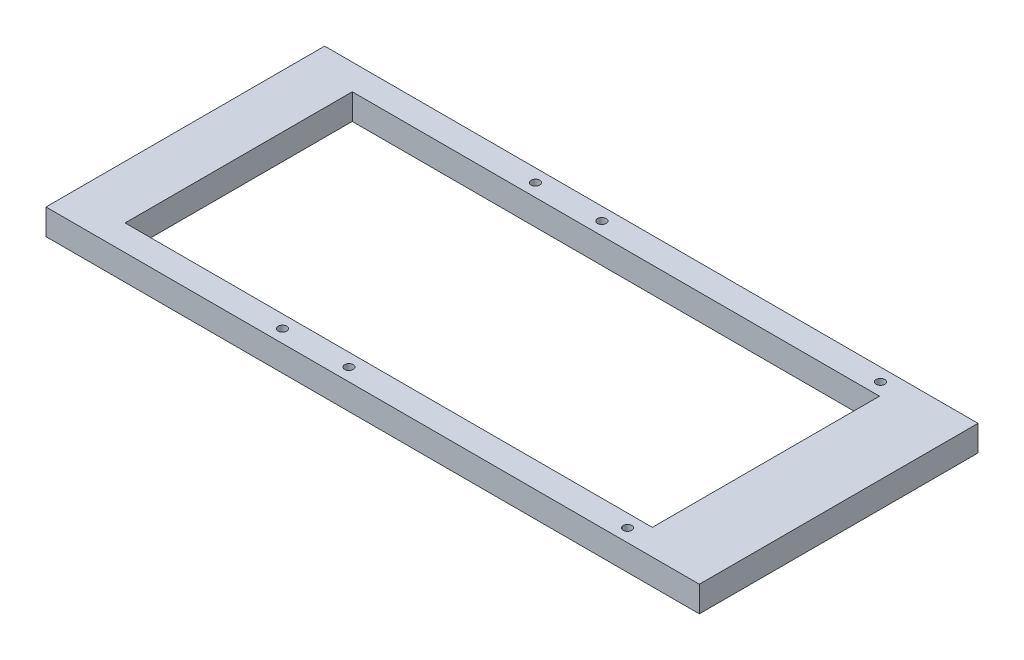
ISO-10303-21;
HEADER;
FILE_DESCRIPTION(('STEP AP214'),'2;1');
FILE_NAME('part.step','',(''),(''),'','','');
FILE_SCHEMA(('AUTOMOTIVE_DESIGN { 1 0 10303 214 1 1 1 1 }'));
ENDSEC;
DATA;
#1=APPLICATION_CONTEXT('core data for automotive mechanical design processes');
#2=APPLICATION_PROTOCOL_DEFINITION('international standard','automotive_design',2000,#1);
#3=PRODUCT_CONTEXT('',#1,'mechanical');
#4=PRODUCT('Part','Part','',(#3));
#5=PRODUCT_RELATED_PRODUCT_CATEGORY('part','',(#4));
#6=PRODUCT_DEFINITION_FORMATION('','',#4);
#7=PRODUCT_DEFINITION_CONTEXT('part definition',#1,'design');
#8=PRODUCT_DEFINITION('design','',#6,#7);
#9=PRODUCT_DEFINITION_SHAPE('','',#8);
#10=(LENGTH_UNIT() NAMED_UNIT(*) SI_UNIT(.MILLI.,.METRE.));
#11=(NAMED_UNIT(*) PLANE_ANGLE_UNIT() SI_UNIT($,.RADIAN.));
#12=(NAMED_UNIT(*) SI_UNIT($,.STERADIAN.) SOLID_ANGLE_UNIT());
#13=UNCERTAINTY_MEASURE_WITH_UNIT(LENGTH_MEASURE(1.E-05),#10,'distance_accuracy_value','');
#14=(GEOMETRIC_REPRESENTATION_CONTEXT(3) GLOBAL_UNCERTAINTY_ASSIGNED_CONTEXT((#13)) GLOBAL_UNIT_ASSIGNED_CONTEXT((#10,
#11,#12)) REPRESENTATION_CONTEXT('',''));
#15=CARTESIAN_POINT('',(0.,0.,0.));
#16=DIRECTION('',(0.,0.,1.));
#17=DIRECTION('',(1.,0.,0.));
#18=AXIS2_PLACEMENT_3D('',#15,#16,#17);
#19=CARTESIAN_POINT('',(0.,12.,0.));
#20=DIRECTION('',(0.,1.,0.));
#21=DIRECTION('',(0.,0.,1.));
#22=AXIS2_PLACEMENT_3D('',#19,#20,#21);
#23=PLANE('',#22);
#24=CARTESIAN_POINT('',(95.4999999999999,12.,-59.));
#25=DIRECTION('',(0.,-1.,0.));
#26=DIRECTION('',(0.,0.,-1.));
#27=AXIS2_PLACEMENT_3D('',#24,#25,#26);
#28=CIRCLE('',#27,2.);
#29=CARTESIAN_POINT('',(95.4999999999999,12.,-61.));
#30=VERTEX_POINT('',#29);
#31=EDGE_CURVE('E196',#30,#30,#28,.T.);
#32=ORIENTED_EDGE('',*,*,#31,.T.);
#33=EDGE_LOOP('',(#32));
#34=FACE_BOUND('',#33,.T.);
#35=CARTESIAN_POINT('',(95.4999999999999,12.,59.));
#36=DIRECTION('',(0.,1.,0.));
#37=DIRECTION('',(0.,0.,1.));
#38=AXIS2_PLACEMENT_3D('',#35,#36,#37);
#39=CIRCLE('',#38,2.);
#40=CARTESIAN_POINT('',(95.4999999999999,12.,61.));
#41=VERTEX_POINT('',#40);
#42=EDGE_CURVE('E186',#41,#41,#39,.T.);
#43=ORIENTED_EDGE('',*,*,#42,.F.);
#44=EDGE_LOOP('',(#43));
#45=FACE_BOUND('',#44,.T.);
#46=CARTESIAN_POINT('',(-34.5000000000001,12.,59.));
#47=DIRECTION('',(0.,1.,0.));
#48=DIRECTION('',(0.,0.,1.));
#49=AXIS2_PLACEMENT_3D('',#46,#47,#48);
#50=CIRCLE('',#49,2.);
#51=CARTESIAN_POINT('',(-34.5000000000001,12.,61.));
#52=VERTEX_POINT('',#51);
#53=EDGE_CURVE('E183',#52,#52,#50,.T.);
#54=ORIENTED_EDGE('',*,*,#53,.F.);
#55=EDGE_LOOP('',(#54));
#56=FACE_BOUND('',#55,.T.);
#57=CARTESIAN_POINT('',(-34.5000000000001,12.,-59.));
#58=DIRECTION('',(0.,-1.,0.));
#59=DIRECTION('',(0.,0.,-1.));
#60=AXIS2_PLACEMENT_3D('',#57,#58,#59);
#61=CIRCLE('',#60,2.);
#62=CARTESIAN_POINT('',(-34.5000000000001,12.,-61.));
#63=VERTEX_POINT('',#62);
#64=EDGE_CURVE('E180',#63,#63,#61,.T.);
#65=ORIENTED_EDGE('',*,*,#64,.T.);
#66=EDGE_LOOP('',(#65));
#67=FACE_BOUND('',#66,.T.);
#68=CARTESIAN_POINT('',(-65.5000000000001,12.,-59.));
#69=DIRECTION('',(0.,-1.,0.));
#70=DIRECTION('',(0.,0.,-1.));
#71=AXIS2_PLACEMENT_3D('',#68,#69,#70);
#72=CIRCLE('',#71,2.);
#73=CARTESIAN_POINT('',(-65.5000000000001,12.,-61.));
#74=VERTEX_POINT('',#73);
#75=EDGE_CURVE('E176',#74,#74,#72,.T.);
#76=ORIENTED_EDGE('',*,*,#75,.T.);
#77=EDGE_LOOP('',(#76));
#78=FACE_BOUND('',#77,.T.);
#79=CARTESIAN_POINT('',(-65.5000000000001,12.,59.));
#80=DIRECTION('',(0.,1.,0.));
#81=DIRECTION('',(0.,0.,1.));
#82=AXIS2_PLACEMENT_3D('',#79,#80,#81);
#83=CIRCLE('',#82,2.);
#84=CARTESIAN_POINT('',(-65.5000000000001,12.,61.));
#85=VERTEX_POINT('',#84);
#86=EDGE_CURVE('E172',#85,#85,#83,.T.);
#87=ORIENTED_EDGE('',*,*,#86,.F.);
#88=EDGE_LOOP('',(#87));
#89=FACE_BOUND('',#88,.T.);
#90=DIRECTION('',(0.,0.,-1.));
#91=VECTOR('',#90,1.);
#92=CARTESIAN_POINT('',(135.,12.,-65.));
#93=LINE('',#92,#91);
#94=CARTESIAN_POINT('',(135.,12.,65.));
#95=VERTEX_POINT('',#94);
#96=CARTESIAN_POINT('',(135.,12.,-65.));
#97=VERTEX_POINT('',#96);
#98=EDGE_CURVE('E144',#95,#97,#93,.T.);
#99=ORIENTED_EDGE('',*,*,#98,.T.);
#100=DIRECTION('',(-1.,0.,0.));
#101=VECTOR('',#100,1.);
#102=CARTESIAN_POINT('',(-135.,12.,-65.));
#103=LINE('',#102,#101);
#104=CARTESIAN_POINT('',(-169.840376893696,12.,-65.));
#105=VERTEX_POINT('',#104);
#106=EDGE_CURVE('E147',#97,#105,#103,.T.);
#107=ORIENTED_EDGE('',*,*,#106,.T.);
#108=DIRECTION('',(0.,0.,1.));
#109=VECTOR('',#108,1.);
#110=CARTESIAN_POINT('',(-169.840376893696,12.,65.));
#111=LINE('',#110,#109);
#112=CARTESIAN_POINT('',(-169.840376893696,12.,65.));
#113=VERTEX_POINT('',#112);
#114=EDGE_CURVE('E150',#105,#113,#111,.T.);
#115=ORIENTED_EDGE('',*,*,#114,.T.);
#116=DIRECTION('',(1.,0.,0.));
#117=VECTOR('',#116,1.);
#118=CARTESIAN_POINT('',(-135.,12.,65.));
#119=LINE('',#118,#117);
#120=EDGE_CURVE('E152',#113,#95,#119,.T.);
#121=ORIENTED_EDGE('',*,*,#120,.T.);
#122=EDGE_LOOP('',(#99,#107,#115,#121));
#123=FACE_BOUND('',#122,.T.);
#124=DIRECTION('',(-1.,0.,0.));
#125=VECTOR('',#124,1.);
#126=CARTESIAN_POINT('',(-144.947414211765,12.,-53.));
#127=LINE('',#126,#125);
#128=CARTESIAN_POINT('',(101.052585788235,12.,-53.));
#129=VERTEX_POINT('',#128);
#130=CARTESIAN_POINT('',(-144.947414211765,12.,-53.));
#131=VERTEX_POINT('',#130);
#132=EDGE_CURVE('E114',#129,#131,#127,.T.);
#133=ORIENTED_EDGE('',*,*,#132,.F.);
#134=DIRECTION('',(0.,0.,-1.));
#135=VECTOR('',#134,1.);
#136=CARTESIAN_POINT('',(101.052585788235,12.,-53.));
#137=LINE('',#136,#135);
#138=CARTESIAN_POINT('',(101.052585788235,12.,53.));
#139=VERTEX_POINT('',#138);
#140=EDGE_CURVE('E106',#139,#129,#137,.T.);
#141=ORIENTED_EDGE('',*,*,#140,.F.);
#142=DIRECTION('',(1.,0.,0.));
#143=VECTOR('',#142,1.);
#144=CARTESIAN_POINT('',(-144.947414211765,12.,53.));
#145=LINE('',#144,#143);
#146=CARTESIAN_POINT('',(-144.947414211765,12.,53.));
#147=VERTEX_POINT('',#146);
#148=EDGE_CURVE('E128',#147,#139,#145,.T.);
#149=ORIENTED_EDGE('',*,*,#148,.F.);
#150=DIRECTION('',(0.,0.,1.));
#151=VECTOR('',#150,1.);
#152=CARTESIAN_POINT('',(-144.947414211765,12.,-53.));
#153=LINE('',#152,#151);
#154=EDGE_CURVE('E126',#131,#147,#153,.T.);
#155=ORIENTED_EDGE('',*,*,#154,.F.);
#156=EDGE_LOOP('',(#133,#141,#149,#155));
#157=FACE_BOUND('',#156,.T.);
#158=ADVANCED_FACE('F39',(#34,#45,#56,#67,#78,#89,#123,#157),#23,.T.);
#159=CARTESIAN_POINT('',(0.,0.,0.));
#160=DIRECTION('',(0.,1.,0.));
#161=DIRECTION('',(0.,0.,1.));
#162=AXIS2_PLACEMENT_3D('',#159,#160,#161);
#163=PLANE('',#162);
#164=CARTESIAN_POINT('',(95.4999999999999,0.,-59.));
#165=DIRECTION('',(0.,1.,0.));
#166=DIRECTION('',(0.,0.,1.));
#167=AXIS2_PLACEMENT_3D('',#164,#165,#166);
#168=CIRCLE('',#167,2.);
#169=CARTESIAN_POINT('',(95.4999999999999,0.,-57.));
#170=VERTEX_POINT('',#169);
#171=EDGE_CURVE('E43',#170,#170,#168,.F.);
#172=ORIENTED_EDGE('',*,*,#171,.F.);
#173=EDGE_LOOP('',(#172));
#174=FACE_BOUND('',#173,.T.);
#175=CARTESIAN_POINT('',(95.4999999999999,0.,59.));
#176=DIRECTION('',(0.,1.,0.));
#177=DIRECTION('',(0.,0.,1.));
#178=AXIS2_PLACEMENT_3D('',#175,#176,#177);
#179=CIRCLE('',#178,2.);
#180=CARTESIAN_POINT('',(95.4999999999999,0.,61.));
#181=VERTEX_POINT('',#180);
#182=EDGE_CURVE('E184',#181,#181,#179,.T.);
#183=ORIENTED_EDGE('',*,*,#182,.T.);
#184=EDGE_LOOP('',(#183));
#185=FACE_BOUND('',#184,.T.);
#186=CARTESIAN_POINT('',(-34.5000000000001,0.,59.));
#187=DIRECTION('',(0.,1.,0.));
#188=DIRECTION('',(0.,0.,1.));
#189=AXIS2_PLACEMENT_3D('',#186,#187,#188);
#190=CIRCLE('',#189,2.);
#191=CARTESIAN_POINT('',(-34.5000000000001,0.,61.));
#192=VERTEX_POINT('',#191);
#193=EDGE_CURVE('E181',#192,#192,#190,.T.);
#194=ORIENTED_EDGE('',*,*,#193,.T.);
#195=EDGE_LOOP('',(#194));
#196=FACE_BOUND('',#195,.T.);
#197=CARTESIAN_POINT('',(-34.5000000000001,0.,-59.));
#198=DIRECTION('',(0.,1.,0.));
#199=DIRECTION('',(0.,0.,1.));
#200=AXIS2_PLACEMENT_3D('',#197,#198,#199);
#201=CIRCLE('',#200,2.);
#202=CARTESIAN_POINT('',(-34.5000000000001,0.,-57.));
#203=VERTEX_POINT('',#202);
#204=EDGE_CURVE('E177',#203,#203,#201,.F.);
#205=ORIENTED_EDGE('',*,*,#204,.F.);
#206=EDGE_LOOP('',(#205));
#207=FACE_BOUND('',#206,.T.);
#208=CARTESIAN_POINT('',(-65.5000000000001,0.,-59.));
#209=DIRECTION('',(0.,1.,0.));
#210=DIRECTION('',(0.,0.,1.));
#211=AXIS2_PLACEMENT_3D('',#208,#209,#210);
#212=CIRCLE('',#211,2.);
#213=CARTESIAN_POINT('',(-65.5000000000001,0.,-57.));
#214=VERTEX_POINT('',#213);
#215=EDGE_CURVE('E173',#214,#214,#212,.F.);
#216=ORIENTED_EDGE('',*,*,#215,.F.);
#217=EDGE_LOOP('',(#216));
#218=FACE_BOUND('',#217,.T.);
#219=CARTESIAN_POINT('',(-65.5000000000001,0.,59.));
#220=DIRECTION('',(0.,1.,0.));
#221=DIRECTION('',(0.,0.,1.));
#222=AXIS2_PLACEMENT_3D('',#219,#220,#221);
#223=CIRCLE('',#222,2.);
#224=CARTESIAN_POINT('',(-65.5000000000001,0.,61.));
#225=VERTEX_POINT('',#224);
#226=EDGE_CURVE('E134',#225,#225,#223,.T.);
#227=ORIENTED_EDGE('',*,*,#226,.T.);
#228=EDGE_LOOP('',(#227));
#229=FACE_BOUND('',#228,.T.);
#230=DIRECTION('',(0.,0.,-1.));
#231=VECTOR('',#230,1.);
#232=CARTESIAN_POINT('',(135.,0.,-65.));
#233=LINE('',#232,#231);
#234=CARTESIAN_POINT('',(135.,0.,65.));
#235=VERTEX_POINT('',#234);
#236=CARTESIAN_POINT('',(135.,0.,-65.));
#237=VERTEX_POINT('',#236);
#238=EDGE_CURVE('E122',#235,#237,#233,.T.);
#239=ORIENTED_EDGE('',*,*,#238,.F.);
#240=DIRECTION('',(1.,0.,0.));
#241=VECTOR('',#240,1.);
#242=CARTESIAN_POINT('',(-135.,0.,65.));
#243=LINE('',#242,#241);
#244=CARTESIAN_POINT('',(-169.840376893696,0.,65.));
#245=VERTEX_POINT('',#244);
#246=EDGE_CURVE('E148',#245,#235,#243,.T.);
#247=ORIENTED_EDGE('',*,*,#246,.F.);
#248=DIRECTION('',(0.,0.,1.));
#249=VECTOR('',#248,1.);
#250=CARTESIAN_POINT('',(-169.840376893696,0.,65.));
#251=LINE('',#250,#249);
#252=CARTESIAN_POINT('',(-169.840376893696,0.,-65.));
#253=VERTEX_POINT('',#252);
#254=EDGE_CURVE('E159',#253,#245,#251,.T.);
#255=ORIENTED_EDGE('',*,*,#254,.F.);
#256=DIRECTION('',(-1.,0.,0.));
#257=VECTOR('',#256,1.);
#258=CARTESIAN_POINT('',(-169.840376893696,0.,-65.));
#259=LINE('',#258,#257);
#260=EDGE_CURVE('E157',#237,#253,#259,.T.);
#261=ORIENTED_EDGE('',*,*,#260,.F.);
#262=EDGE_LOOP('',(#239,#247,#255,#261));
#263=FACE_BOUND('',#262,.T.);
#264=DIRECTION('',(0.,0.,-1.));
#265=VECTOR('',#264,1.);
#266=CARTESIAN_POINT('',(101.052585788235,0.,-53.));
#267=LINE('',#266,#265);
#268=CARTESIAN_POINT('',(101.052585788235,0.,53.));
#269=VERTEX_POINT('',#268);
#270=CARTESIAN_POINT('',(101.052585788235,0.,-53.));
#271=VERTEX_POINT('',#270);
#272=EDGE_CURVE('E64',#269,#271,#267,.T.);
#273=ORIENTED_EDGE('',*,*,#272,.T.);
#274=DIRECTION('',(-1.,0.,0.));
#275=VECTOR('',#274,1.);
#276=CARTESIAN_POINT('',(-144.947414211765,0.,-53.));
#277=LINE('',#276,#275);
#278=CARTESIAN_POINT('',(-144.947414211765,0.,-53.));
#279=VERTEX_POINT('',#278);
#280=EDGE_CURVE('E121',#271,#279,#277,.T.);
#281=ORIENTED_EDGE('',*,*,#280,.T.);
#282=DIRECTION('',(0.,0.,1.));
#283=VECTOR('',#282,1.);
#284=CARTESIAN_POINT('',(-144.947414211765,0.,-53.));
#285=LINE('',#284,#283);
#286=CARTESIAN_POINT('',(-144.947414211765,0.,53.));
#287=VERTEX_POINT('',#286);
#288=EDGE_CURVE('E136',#279,#287,#285,.T.);
#289=ORIENTED_EDGE('',*,*,#288,.T.);
#290=DIRECTION('',(1.,0.,0.));
#291=VECTOR('',#290,1.);
#292=CARTESIAN_POINT('',(-144.947414211765,0.,53.));
#293=LINE('',#292,#291);
#294=EDGE_CURVE('E115',#287,#269,#293,.T.);
#295=ORIENTED_EDGE('',*,*,#294,.T.);
#296=EDGE_LOOP('',(#273,#281,#289,#295));
#297=FACE_BOUND('',#296,.T.);
#298=ADVANCED_FACE('F210',(#174,#185,#196,#207,#218,#229,#263,#297),#163,.F.);
#299=CARTESIAN_POINT('',(135.,12.,-65.));
#300=DIRECTION('',(-1.,0.,0.));
#301=DIRECTION('',(0.,0.,1.));
#302=AXIS2_PLACEMENT_3D('',#299,#300,#301);
#303=PLANE('',#302);
#304=ORIENTED_EDGE('',*,*,#238,.T.);
#305=DIRECTION('',(0.,-1.,0.));
#306=VECTOR('',#305,1.);
#307=CARTESIAN_POINT('',(135.,12.,-65.));
#308=LINE('',#307,#306);
#309=EDGE_CURVE('E11',#97,#237,#308,.T.);
#310=ORIENTED_EDGE('',*,*,#309,.F.);
#311=ORIENTED_EDGE('',*,*,#98,.F.);
#312=DIRECTION('',(0.,-1.,0.));
#313=VECTOR('',#312,1.);
#314=CARTESIAN_POINT('',(135.,12.,65.));
#315=LINE('',#314,#313);
#316=EDGE_CURVE('E154',#95,#235,#315,.T.);
#317=ORIENTED_EDGE('',*,*,#316,.T.);
#318=EDGE_LOOP('',(#304,#310,#311,#317));
#319=FACE_BOUND('',#318,.T.);
#320=ADVANCED_FACE('F41',(#319),#303,.F.);
#321=CARTESIAN_POINT('',(-169.840376893696,12.,-65.));
#322=DIRECTION('',(0.,0.,1.));
#323=DIRECTION('',(1.,0.,0.));
#324=AXIS2_PLACEMENT_3D('',#321,#322,#323);
#325=PLANE('',#324);
#326=ORIENTED_EDGE('',*,*,#260,.T.);
#327=DIRECTION('',(0.,-1.,0.));
#328=VECTOR('',#327,1.);
#329=CARTESIAN_POINT('',(-169.840376893696,12.,-65.));
#330=LINE('',#329,#328);
#331=EDGE_CURVE('E48',#105,#253,#330,.T.);
#332=ORIENTED_EDGE('',*,*,#331,.F.);
#333=ORIENTED_EDGE('',*,*,#106,.F.);
#334=ORIENTED_EDGE('',*,*,#309,.T.);
#335=EDGE_LOOP('',(#326,#332,#333,#334));
#336=FACE_BOUND('',#335,.T.);
#337=ADVANCED_FACE('F221',(#336),#325,.F.);
#338=CARTESIAN_POINT('',(-169.840376893696,12.,65.));
#339=DIRECTION('',(1.,0.,0.));
#340=DIRECTION('',(0.,0.,-1.));
#341=AXIS2_PLACEMENT_3D('',#338,#339,#340);
#342=PLANE('',#341);
#343=ORIENTED_EDGE('',*,*,#254,.T.);
#344=DIRECTION('',(0.,-1.,0.));
#345=VECTOR('',#344,1.);
#346=CARTESIAN_POINT('',(-169.840376893696,12.,65.));
#347=LINE('',#346,#345);
#348=EDGE_CURVE('E165',#113,#245,#347,.T.);
#349=ORIENTED_EDGE('',*,*,#348,.F.);
#350=ORIENTED_EDGE('',*,*,#114,.F.);
#351=ORIENTED_EDGE('',*,*,#331,.T.);
#352=EDGE_LOOP('',(#343,#349,#350,#351));
#353=FACE_BOUND('',#352,.T.);
#354=ADVANCED_FACE('F226',(#353),#342,.F.);
#355=CARTESIAN_POINT('',(-135.,12.,65.));
#356=DIRECTION('',(0.,0.,-1.));
#357=DIRECTION('',(-1.,0.,0.));
#358=AXIS2_PLACEMENT_3D('',#355,#356,#357);
#359=PLANE('',#358);
#360=ORIENTED_EDGE('',*,*,#246,.T.);
#361=ORIENTED_EDGE('',*,*,#316,.F.);
#362=ORIENTED_EDGE('',*,*,#120,.F.);
#363=ORIENTED_EDGE('',*,*,#348,.T.);
#364=EDGE_LOOP('',(#360,#361,#362,#363));
#365=FACE_BOUND('',#364,.T.);
#366=ADVANCED_FACE('F228',(#365),#359,.F.);
#367=CARTESIAN_POINT('',(101.052585788235,12.,-53.));
#368=DIRECTION('',(-1.,0.,0.));
#369=DIRECTION('',(0.,0.,1.));
#370=AXIS2_PLACEMENT_3D('',#367,#368,#369);
#371=PLANE('',#370);
#372=ORIENTED_EDGE('',*,*,#272,.F.);
#373=DIRECTION('',(0.,-1.,0.));
#374=VECTOR('',#373,1.);
#375=CARTESIAN_POINT('',(101.052585788235,12.,53.));
#376=LINE('',#375,#374);
#377=EDGE_CURVE('E110',#139,#269,#376,.T.);
#378=ORIENTED_EDGE('',*,*,#377,.F.);
#379=ORIENTED_EDGE('',*,*,#140,.T.);
#380=DIRECTION('',(0.,-1.,0.));
#381=VECTOR('',#380,1.);
#382=CARTESIAN_POINT('',(101.052585788235,12.,-53.));
#383=LINE('',#382,#381);
#384=EDGE_CURVE('E109',#129,#271,#383,.T.);
#385=ORIENTED_EDGE('',*,*,#384,.T.);
#386=EDGE_LOOP('',(#372,#378,#379,#385));
#387=FACE_BOUND('',#386,.T.);
#388=ADVANCED_FACE('F108',(#387),#371,.T.);
#389=CARTESIAN_POINT('',(-144.947414211765,12.,-53.));
#390=DIRECTION('',(0.,0.,1.));
#391=DIRECTION('',(1.,0.,0.));
#392=AXIS2_PLACEMENT_3D('',#389,#390,#391);
#393=PLANE('',#392);
#394=ORIENTED_EDGE('',*,*,#280,.F.);
#395=ORIENTED_EDGE('',*,*,#384,.F.);
#396=ORIENTED_EDGE('',*,*,#132,.T.);
#397=DIRECTION('',(0.,-1.,0.));
#398=VECTOR('',#397,1.);
#399=CARTESIAN_POINT('',(-144.947414211765,12.,-53.));
#400=LINE('',#399,#398);
#401=EDGE_CURVE('E123',#131,#279,#400,.T.);
#402=ORIENTED_EDGE('',*,*,#401,.T.);
#403=EDGE_LOOP('',(#394,#395,#396,#402));
#404=FACE_BOUND('',#403,.T.);
#405=ADVANCED_FACE('F118',(#404),#393,.T.);
#406=CARTESIAN_POINT('',(-144.947414211765,12.,-53.));
#407=DIRECTION('',(1.,0.,0.));
#408=DIRECTION('',(0.,0.,-1.));
#409=AXIS2_PLACEMENT_3D('',#406,#407,#408);
#410=PLANE('',#409);
#411=ORIENTED_EDGE('',*,*,#288,.F.);
#412=ORIENTED_EDGE('',*,*,#401,.F.);
#413=ORIENTED_EDGE('',*,*,#154,.T.);
#414=DIRECTION('',(0.,-1.,0.));
#415=VECTOR('',#414,1.);
#416=CARTESIAN_POINT('',(-144.947414211765,12.,53.));
#417=LINE('',#416,#415);
#418=EDGE_CURVE('E56',#147,#287,#417,.T.);
#419=ORIENTED_EDGE('',*,*,#418,.T.);
#420=EDGE_LOOP('',(#411,#412,#413,#419));
#421=FACE_BOUND('',#420,.T.);
#422=ADVANCED_FACE('F237',(#421),#410,.T.);
#423=CARTESIAN_POINT('',(-144.947414211765,12.,53.));
#424=DIRECTION('',(0.,0.,-1.));
#425=DIRECTION('',(-1.,0.,0.));
#426=AXIS2_PLACEMENT_3D('',#423,#424,#425);
#427=PLANE('',#426);
#428=ORIENTED_EDGE('',*,*,#294,.F.);
#429=ORIENTED_EDGE('',*,*,#418,.F.);
#430=ORIENTED_EDGE('',*,*,#148,.T.);
#431=ORIENTED_EDGE('',*,*,#377,.T.);
#432=EDGE_LOOP('',(#428,#429,#430,#431));
#433=FACE_BOUND('',#432,.T.);
#434=ADVANCED_FACE('F235',(#433),#427,.T.);
#435=CARTESIAN_POINT('',(-65.5000000000001,-38.25,59.));
#436=DIRECTION('',(0.,1.,0.));
#437=DIRECTION('',(0.,0.,1.));
#438=AXIS2_PLACEMENT_3D('',#435,#436,#437);
#439=CYLINDRICAL_SURFACE('',#438,2.);
#440=ORIENTED_EDGE('',*,*,#86,.T.);
#441=EDGE_LOOP('',(#440));
#442=FACE_BOUND('',#441,.T.);
#443=ORIENTED_EDGE('',*,*,#226,.F.);
#444=EDGE_LOOP('',(#443));
#445=FACE_BOUND('',#444,.T.);
#446=ADVANCED_FACE('F205',(#442,#445),#439,.F.);
#447=CARTESIAN_POINT('',(-65.5000000000001,-38.25,-59.));
#448=DIRECTION('',(0.,1.,0.));
#449=DIRECTION('',(0.,0.,1.));
#450=AXIS2_PLACEMENT_3D('',#447,#448,#449);
#451=CYLINDRICAL_SURFACE('',#450,2.);
#452=ORIENTED_EDGE('',*,*,#75,.F.);
#453=EDGE_LOOP('',(#452));
#454=FACE_BOUND('',#453,.T.);
#455=ORIENTED_EDGE('',*,*,#215,.T.);
#456=EDGE_LOOP('',(#455));
#457=FACE_BOUND('',#456,.T.);
#458=ADVANCED_FACE('F243',(#454,#457),#451,.F.);
#459=CARTESIAN_POINT('',(-34.5000000000001,-38.25,-59.));
#460=DIRECTION('',(0.,1.,0.));
#461=DIRECTION('',(0.,0.,1.));
#462=AXIS2_PLACEMENT_3D('',#459,#460,#461);
#463=CYLINDRICAL_SURFACE('',#462,2.);
#464=ORIENTED_EDGE('',*,*,#64,.F.);
#465=EDGE_LOOP('',(#464));
#466=FACE_BOUND('',#465,.T.);
#467=ORIENTED_EDGE('',*,*,#204,.T.);
#468=EDGE_LOOP('',(#467));
#469=FACE_BOUND('',#468,.T.);
#470=ADVANCED_FACE('F295',(#466,#469),#463,.F.);
#471=CARTESIAN_POINT('',(-34.5000000000001,-38.25,59.));
#472=DIRECTION('',(0.,1.,0.));
#473=DIRECTION('',(0.,0.,1.));
#474=AXIS2_PLACEMENT_3D('',#471,#472,#473);
#475=CYLINDRICAL_SURFACE('',#474,2.);
#476=ORIENTED_EDGE('',*,*,#53,.T.);
#477=EDGE_LOOP('',(#476));
#478=FACE_BOUND('',#477,.T.);
#479=ORIENTED_EDGE('',*,*,#193,.F.);
#480=EDGE_LOOP('',(#479));
#481=FACE_BOUND('',#480,.T.);
#482=ADVANCED_FACE('F283',(#478,#481),#475,.F.);
#483=CARTESIAN_POINT('',(95.4999999999999,-38.25,59.));
#484=DIRECTION('',(0.,1.,0.));
#485=DIRECTION('',(0.,0.,1.));
#486=AXIS2_PLACEMENT_3D('',#483,#484,#485);
#487=CYLINDRICAL_SURFACE('',#486,2.);
#488=ORIENTED_EDGE('',*,*,#42,.T.);
#489=EDGE_LOOP('',(#488));
#490=FACE_BOUND('',#489,.T.);
#491=ORIENTED_EDGE('',*,*,#182,.F.);
#492=EDGE_LOOP('',(#491));
#493=FACE_BOUND('',#492,.T.);
#494=ADVANCED_FACE('F277',(#490,#493),#487,.F.);
#495=CARTESIAN_POINT('',(95.4999999999999,-38.25,-59.));
#496=DIRECTION('',(0.,1.,0.));
#497=DIRECTION('',(0.,0.,1.));
#498=AXIS2_PLACEMENT_3D('',#495,#496,#497);
#499=CYLINDRICAL_SURFACE('',#498,2.);
#500=ORIENTED_EDGE('',*,*,#31,.F.);
#501=EDGE_LOOP('',(#500));
#502=FACE_BOUND('',#501,.T.);
#503=ORIENTED_EDGE('',*,*,#171,.T.);
#504=EDGE_LOOP('',(#503));
#505=FACE_BOUND('',#504,.T.);
#506=ADVANCED_FACE('F282',(#502,#505),#499,.F.);
#507=CLOSED_SHELL('',(#158,#298,#320,#337,#354,#366,#388,#405,#422,#434,#446,#458,#470,#482,
#494,#506));
#508=MANIFOLD_SOLID_BREP('B2',#507);
#509=ADVANCED_BREP_SHAPE_REPRESENTATION('',(#18,#508),#14);
#510=SHAPE_DEFINITION_REPRESENTATION(#9,#509);
ENDSEC;
END-ISO-10303-21;
